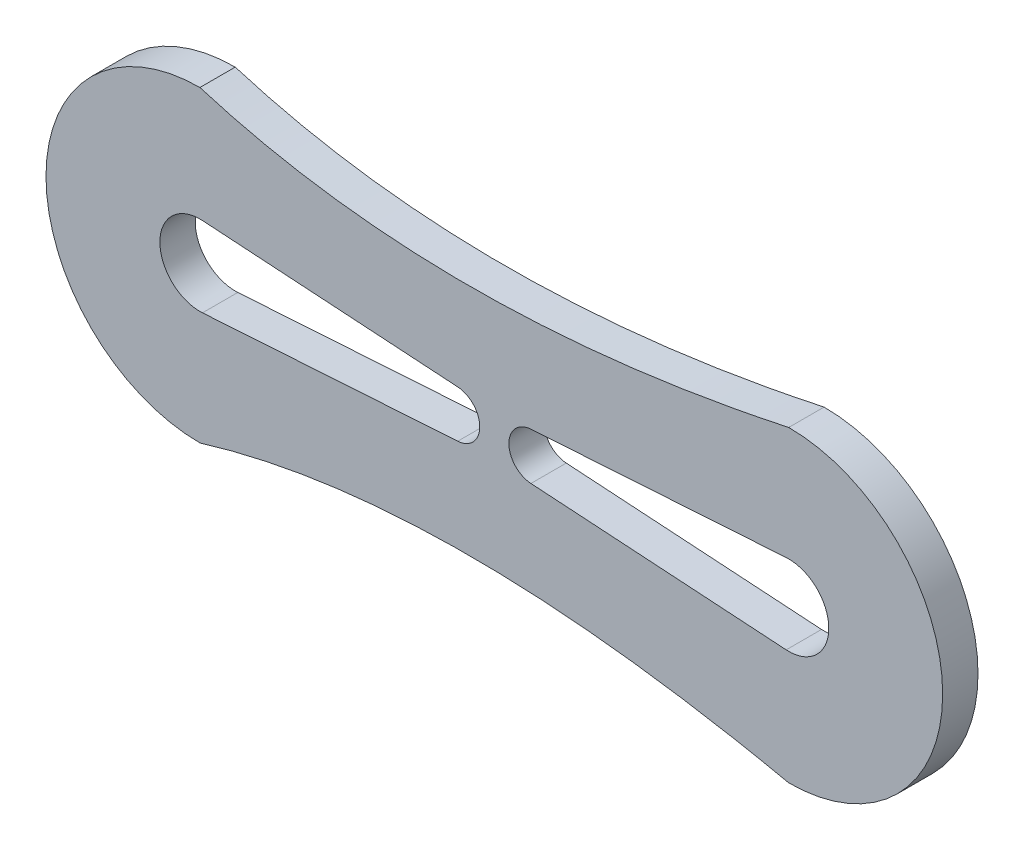
ISO-10303-21;
HEADER;
FILE_DESCRIPTION(('STEP AP214'),'2;1');
FILE_NAME('part.step','',(''),(''),'','','');
FILE_SCHEMA(('AUTOMOTIVE_DESIGN { 1 0 10303 214 1 1 1 1 }'));
ENDSEC;
DATA;
#1=APPLICATION_CONTEXT('core data for automotive mechanical design processes');
#2=APPLICATION_PROTOCOL_DEFINITION('international standard','automotive_design',2000,#1);
#3=PRODUCT_CONTEXT('',#1,'mechanical');
#4=PRODUCT('Part','Part','',(#3));
#5=PRODUCT_RELATED_PRODUCT_CATEGORY('part','',(#4));
#6=PRODUCT_DEFINITION_FORMATION('','',#4);
#7=PRODUCT_DEFINITION_CONTEXT('part definition',#1,'design');
#8=PRODUCT_DEFINITION('design','',#6,#7);
#9=PRODUCT_DEFINITION_SHAPE('','',#8);
#10=(LENGTH_UNIT() NAMED_UNIT(*) SI_UNIT(.MILLI.,.METRE.));
#11=(NAMED_UNIT(*) PLANE_ANGLE_UNIT() SI_UNIT($,.RADIAN.));
#12=(NAMED_UNIT(*) SI_UNIT($,.STERADIAN.) SOLID_ANGLE_UNIT());
#13=UNCERTAINTY_MEASURE_WITH_UNIT(LENGTH_MEASURE(1.E-05),#10,'distance_accuracy_value','');
#14=(GEOMETRIC_REPRESENTATION_CONTEXT(3) GLOBAL_UNCERTAINTY_ASSIGNED_CONTEXT((#13)) GLOBAL_UNIT_ASSIGNED_CONTEXT((#10,
#11,#12)) REPRESENTATION_CONTEXT('',''));
#15=CARTESIAN_POINT('',(0.,0.,0.));
#16=DIRECTION('',(0.,0.,1.));
#17=DIRECTION('',(1.,0.,0.));
#18=AXIS2_PLACEMENT_3D('',#15,#16,#17);
#19=CARTESIAN_POINT('',(-25.,0.,3.));
#20=DIRECTION('',(0.,0.,-1.));
#21=DIRECTION('',(-1.,0.,0.));
#22=AXIS2_PLACEMENT_3D('',#19,#20,#21);
#23=CYLINDRICAL_SURFACE('',#22,13.069);
#24=CARTESIAN_POINT('',(-25.,0.,0.));
#25=DIRECTION('',(0.,0.,1.));
#26=DIRECTION('',(1.,0.,0.));
#27=AXIS2_PLACEMENT_3D('',#24,#25,#26);
#28=CIRCLE('',#27,13.069);
#29=CARTESIAN_POINT('',(-25.,13.069,0.));
#30=VERTEX_POINT('',#29);
#31=CARTESIAN_POINT('',(-25.,-13.069,0.));
#32=VERTEX_POINT('',#31);
#33=EDGE_CURVE('E242',#30,#32,#28,.T.);
#34=ORIENTED_EDGE('',*,*,#33,.T.);
#35=DIRECTION('',(0.,0.,-1.));
#36=VECTOR('',#35,1.);
#37=CARTESIAN_POINT('',(-25.,-13.069,3.));
#38=LINE('',#37,#36);
#39=CARTESIAN_POINT('',(-25.,-13.069,3.));
#40=VERTEX_POINT('',#39);
#41=EDGE_CURVE('E11',#40,#32,#38,.T.);
#42=ORIENTED_EDGE('',*,*,#41,.F.);
#43=CARTESIAN_POINT('',(-25.,0.,3.));
#44=DIRECTION('',(0.,0.,1.));
#45=DIRECTION('',(1.,0.,0.));
#46=AXIS2_PLACEMENT_3D('',#43,#44,#45);
#47=CIRCLE('',#46,13.069);
#48=CARTESIAN_POINT('',(-25.,13.069,3.));
#49=VERTEX_POINT('',#48);
#50=EDGE_CURVE('E139',#49,#40,#47,.T.);
#51=ORIENTED_EDGE('',*,*,#50,.F.);
#52=DIRECTION('',(0.,0.,-1.));
#53=VECTOR('',#52,1.);
#54=CARTESIAN_POINT('',(-25.,13.069,3.));
#55=LINE('',#54,#53);
#56=EDGE_CURVE('E54',#49,#30,#55,.T.);
#57=ORIENTED_EDGE('',*,*,#56,.T.);
#58=EDGE_LOOP('',(#34,#42,#51,#57));
#59=FACE_BOUND('',#58,.T.);
#60=ADVANCED_FACE('F35',(#59),#23,.T.);
#61=CARTESIAN_POINT('',(-25.,-13.069,3.));
#62=CARTESIAN_POINT('',(-4.3274762398374,-6.75242360120828,3.));
#63=CARTESIAN_POINT('',(25.,-13.069,3.));
#64=B_SPLINE_CURVE_WITH_KNOTS('',2,(#61,#62,#63),.UNSPECIFIED.,.F.,.F.,(3,3),(0.,1.),.UNSPECIFIED.);
#65=DIRECTION('',(0.,0.,-1.));
#66=VECTOR('',#65,1.);
#67=SURFACE_OF_LINEAR_EXTRUSION('',#64,#66);
#68=CARTESIAN_POINT('',(-25.,-13.069,0.));
#69=CARTESIAN_POINT('',(-4.3274762398374,-6.75242360120828,0.));
#70=CARTESIAN_POINT('',(25.,-13.069,0.));
#71=B_SPLINE_CURVE_WITH_KNOTS('',2,(#68,#69,#70),.UNSPECIFIED.,.F.,.F.,(3,3),(0.,1.),.UNSPECIFIED.);
#72=CARTESIAN_POINT('',(25.,-13.069,0.));
#73=VERTEX_POINT('',#72);
#74=EDGE_CURVE('E145',#32,#73,#71,.T.);
#75=ORIENTED_EDGE('',*,*,#74,.T.);
#76=DIRECTION('',(0.,0.,-1.));
#77=VECTOR('',#76,1.);
#78=CARTESIAN_POINT('',(25.,-13.069,3.));
#79=LINE('',#78,#77);
#80=CARTESIAN_POINT('',(25.,-13.069,3.));
#81=VERTEX_POINT('',#80);
#82=EDGE_CURVE('E45',#81,#73,#79,.T.);
#83=ORIENTED_EDGE('',*,*,#82,.F.);
#84=EDGE_CURVE('E133',#40,#81,#64,.T.);
#85=ORIENTED_EDGE('',*,*,#84,.F.);
#86=ORIENTED_EDGE('',*,*,#41,.T.);
#87=EDGE_LOOP('',(#75,#83,#85,#86));
#88=FACE_BOUND('',#87,.T.);
#89=ADVANCED_FACE('F144',(#88),#67,.F.);
#90=CARTESIAN_POINT('',(25.,0.,3.));
#91=DIRECTION('',(0.,0.,-1.));
#92=DIRECTION('',(-1.,0.,0.));
#93=AXIS2_PLACEMENT_3D('',#90,#91,#92);
#94=CYLINDRICAL_SURFACE('',#93,13.069);
#95=CARTESIAN_POINT('',(25.,0.,0.));
#96=DIRECTION('',(0.,0.,1.));
#97=DIRECTION('',(1.,0.,0.));
#98=AXIS2_PLACEMENT_3D('',#95,#96,#97);
#99=CIRCLE('',#98,13.069);
#100=CARTESIAN_POINT('',(25.,13.069,0.));
#101=VERTEX_POINT('',#100);
#102=EDGE_CURVE('E247',#101,#73,#99,.F.);
#103=ORIENTED_EDGE('',*,*,#102,.F.);
#104=DIRECTION('',(0.,0.,-1.));
#105=VECTOR('',#104,1.);
#106=CARTESIAN_POINT('',(25.,13.069,3.));
#107=LINE('',#106,#105);
#108=CARTESIAN_POINT('',(25.,13.069,3.));
#109=VERTEX_POINT('',#108);
#110=EDGE_CURVE('E92',#109,#101,#107,.T.);
#111=ORIENTED_EDGE('',*,*,#110,.F.);
#112=CARTESIAN_POINT('',(25.,0.,3.));
#113=DIRECTION('',(0.,0.,1.));
#114=DIRECTION('',(1.,0.,0.));
#115=AXIS2_PLACEMENT_3D('',#112,#113,#114);
#116=CIRCLE('',#115,13.069);
#117=EDGE_CURVE('E138',#109,#81,#116,.F.);
#118=ORIENTED_EDGE('',*,*,#117,.T.);
#119=ORIENTED_EDGE('',*,*,#82,.T.);
#120=EDGE_LOOP('',(#103,#111,#118,#119));
#121=FACE_BOUND('',#120,.T.);
#122=ADVANCED_FACE('F149',(#121),#94,.T.);
#123=CARTESIAN_POINT('',(-3.236,0.,3.));
#124=DIRECTION('',(0.,0.,-1.));
#125=DIRECTION('',(-1.,0.,0.));
#126=AXIS2_PLACEMENT_3D('',#123,#124,#125);
#127=CYLINDRICAL_SURFACE('',#126,2.);
#128=CARTESIAN_POINT('',(-3.236,0.,0.));
#129=DIRECTION('',(0.,0.,1.));
#130=DIRECTION('',(1.,0.,0.));
#131=AXIS2_PLACEMENT_3D('',#128,#129,#130);
#132=CIRCLE('',#131,2.);
#133=CARTESIAN_POINT('',(-3.10734717882742,-1.99585782349453,0.));
#134=VERTEX_POINT('',#133);
#135=CARTESIAN_POINT('',(-3.10734717882742,1.99585782349453,0.));
#136=VERTEX_POINT('',#135);
#137=EDGE_CURVE('E228',#134,#136,#132,.T.);
#138=ORIENTED_EDGE('',*,*,#137,.F.);
#139=DIRECTION('',(0.,0.,-1.));
#140=VECTOR('',#139,1.);
#141=CARTESIAN_POINT('',(-3.10734717882742,-1.99585782349453,3.));
#142=LINE('',#141,#140);
#143=CARTESIAN_POINT('',(-3.10734717882742,-1.99585782349453,3.));
#144=VERTEX_POINT('',#143);
#145=EDGE_CURVE('E262',#144,#134,#142,.T.);
#146=ORIENTED_EDGE('',*,*,#145,.F.);
#147=CARTESIAN_POINT('',(-3.236,0.,3.));
#148=DIRECTION('',(0.,0.,1.));
#149=DIRECTION('',(1.,0.,0.));
#150=AXIS2_PLACEMENT_3D('',#147,#148,#149);
#151=CIRCLE('',#150,2.);
#152=CARTESIAN_POINT('',(-3.10734717882742,1.99585782349453,3.));
#153=VERTEX_POINT('',#152);
#154=EDGE_CURVE('E277',#144,#153,#151,.T.);
#155=ORIENTED_EDGE('',*,*,#154,.T.);
#156=DIRECTION('',(0.,0.,-1.));
#157=VECTOR('',#156,1.);
#158=CARTESIAN_POINT('',(-3.10734717882742,1.99585782349453,3.));
#159=LINE('',#158,#157);
#160=EDGE_CURVE('E264',#153,#136,#159,.T.);
#161=ORIENTED_EDGE('',*,*,#160,.T.);
#162=EDGE_LOOP('',(#138,#146,#155,#161));
#163=FACE_BOUND('',#162,.T.);
#164=ADVANCED_FACE('F177',(#163),#127,.F.);
#165=CARTESIAN_POINT('',(0.115262618520487,-1.78812867711612,3.));
#166=DIRECTION('',(-0.0643264105862892,0.997928911747267,0.));
#167=DIRECTION('',(-0.997928911747267,-0.0643264105862892,0.));
#168=AXIS2_PLACEMENT_3D('',#165,#166,#167);
#169=PLANE('',#168);
#170=DIRECTION('',(0.997928911747267,0.0643264105862892,0.));
#171=VECTOR('',#170,1.);
#172=CARTESIAN_POINT('',(0.115262618520487,-1.78812867711612,0.));
#173=LINE('',#172,#171);
#174=CARTESIAN_POINT('',(-24.7812902040066,-3.39295829994071,0.));
#175=VERTEX_POINT('',#174);
#176=EDGE_CURVE('E233',#175,#134,#173,.T.);
#177=ORIENTED_EDGE('',*,*,#176,.F.);
#178=DIRECTION('',(0.,0.,-1.));
#179=VECTOR('',#178,1.);
#180=CARTESIAN_POINT('',(-24.7812902040066,-3.39295829994071,3.));
#181=LINE('',#180,#179);
#182=CARTESIAN_POINT('',(-24.7812902040066,-3.39295829994071,3.));
#183=VERTEX_POINT('',#182);
#184=EDGE_CURVE('E268',#183,#175,#181,.T.);
#185=ORIENTED_EDGE('',*,*,#184,.F.);
#186=DIRECTION('',(0.997928911747267,0.0643264105862892,0.));
#187=VECTOR('',#186,1.);
#188=CARTESIAN_POINT('',(0.115262618520487,-1.78812867711612,3.));
#189=LINE('',#188,#187);
#190=EDGE_CURVE('E280',#183,#144,#189,.T.);
#191=ORIENTED_EDGE('',*,*,#190,.T.);
#192=ORIENTED_EDGE('',*,*,#145,.T.);
#193=EDGE_LOOP('',(#177,#185,#191,#192));
#194=FACE_BOUND('',#193,.T.);
#195=ADVANCED_FACE('F190',(#194),#169,.T.);
#196=CARTESIAN_POINT('',(-25.,0.,3.));
#197=DIRECTION('',(0.,0.,-1.));
#198=DIRECTION('',(-1.,0.,0.));
#199=AXIS2_PLACEMENT_3D('',#196,#197,#198);
#200=CYLINDRICAL_SURFACE('',#199,3.4);
#201=CARTESIAN_POINT('',(-25.,0.,0.));
#202=DIRECTION('',(0.,0.,1.));
#203=DIRECTION('',(1.,0.,0.));
#204=AXIS2_PLACEMENT_3D('',#201,#202,#203);
#205=CIRCLE('',#204,3.4);
#206=CARTESIAN_POINT('',(-24.7812902040066,3.39295829994071,0.));
#207=VERTEX_POINT('',#206);
#208=EDGE_CURVE('E236',#207,#175,#205,.T.);
#209=ORIENTED_EDGE('',*,*,#208,.F.);
#210=DIRECTION('',(0.,0.,-1.));
#211=VECTOR('',#210,1.);
#212=CARTESIAN_POINT('',(-24.7812902040066,3.39295829994071,3.));
#213=LINE('',#212,#211);
#214=CARTESIAN_POINT('',(-24.7812902040066,3.39295829994071,3.));
#215=VERTEX_POINT('',#214);
#216=EDGE_CURVE('E266',#215,#207,#213,.T.);
#217=ORIENTED_EDGE('',*,*,#216,.F.);
#218=CARTESIAN_POINT('',(-25.,0.,3.));
#219=DIRECTION('',(0.,0.,1.));
#220=DIRECTION('',(1.,0.,0.));
#221=AXIS2_PLACEMENT_3D('',#218,#219,#220);
#222=CIRCLE('',#221,3.4);
#223=EDGE_CURVE('E287',#215,#183,#222,.T.);
#224=ORIENTED_EDGE('',*,*,#223,.T.);
#225=ORIENTED_EDGE('',*,*,#184,.T.);
#226=EDGE_LOOP('',(#209,#217,#224,#225));
#227=FACE_BOUND('',#226,.T.);
#228=ADVANCED_FACE('F187',(#227),#200,.F.);
#229=CARTESIAN_POINT('',(25.,0.,3.));
#230=DIRECTION('',(0.,0.,-1.));
#231=DIRECTION('',(-1.,0.,0.));
#232=AXIS2_PLACEMENT_3D('',#229,#230,#231);
#233=CYLINDRICAL_SURFACE('',#232,3.4);
#234=CARTESIAN_POINT('',(25.,0.,0.));
#235=DIRECTION('',(0.,0.,1.));
#236=DIRECTION('',(1.,0.,0.));
#237=AXIS2_PLACEMENT_3D('',#234,#235,#236);
#238=CIRCLE('',#237,3.4);
#239=CARTESIAN_POINT('',(24.7812902040066,3.39295829994071,0.));
#240=VERTEX_POINT('',#239);
#241=CARTESIAN_POINT('',(24.7812902040066,-3.3929582999407,0.));
#242=VERTEX_POINT('',#241);
#243=EDGE_CURVE('E162',#240,#242,#238,.F.);
#244=ORIENTED_EDGE('',*,*,#243,.T.);
#245=DIRECTION('',(0.,0.,-1.));
#246=VECTOR('',#245,1.);
#247=CARTESIAN_POINT('',(24.7812902040066,-3.3929582999407,3.));
#248=LINE('',#247,#246);
#249=CARTESIAN_POINT('',(24.7812902040066,-3.3929582999407,3.));
#250=VERTEX_POINT('',#249);
#251=EDGE_CURVE('E39',#250,#242,#248,.T.);
#252=ORIENTED_EDGE('',*,*,#251,.F.);
#253=CARTESIAN_POINT('',(25.,0.,3.));
#254=DIRECTION('',(0.,0.,1.));
#255=DIRECTION('',(1.,0.,0.));
#256=AXIS2_PLACEMENT_3D('',#253,#254,#255);
#257=CIRCLE('',#256,3.4);
#258=CARTESIAN_POINT('',(24.7812902040066,3.39295829994071,3.));
#259=VERTEX_POINT('',#258);
#260=EDGE_CURVE('E257',#259,#250,#257,.F.);
#261=ORIENTED_EDGE('',*,*,#260,.F.);
#262=DIRECTION('',(0.,0.,-1.));
#263=VECTOR('',#262,1.);
#264=CARTESIAN_POINT('',(24.7812902040066,3.39295829994071,3.));
#265=LINE('',#264,#263);
#266=EDGE_CURVE('E152',#259,#240,#265,.T.);
#267=ORIENTED_EDGE('',*,*,#266,.T.);
#268=EDGE_LOOP('',(#244,#252,#261,#267));
#269=FACE_BOUND('',#268,.T.);
#270=ADVANCED_FACE('F37',(#269),#233,.F.);
#271=CARTESIAN_POINT('',(-0.115262618520486,-1.78812867711612,3.));
#272=DIRECTION('',(-0.064326410586289,-0.997928911747267,0.));
#273=DIRECTION('',(0.997928911747267,-0.064326410586289,0.));
#274=AXIS2_PLACEMENT_3D('',#271,#272,#273);
#275=PLANE('',#274);
#276=DIRECTION('',(-0.997928911747267,0.064326410586289,0.));
#277=VECTOR('',#276,1.);
#278=CARTESIAN_POINT('',(-0.115262618520486,-1.78812867711612,0.));
#279=LINE('',#278,#277);
#280=CARTESIAN_POINT('',(3.10734717882743,-1.99585782349453,0.));
#281=VERTEX_POINT('',#280);
#282=EDGE_CURVE('E209',#242,#281,#279,.T.);
#283=ORIENTED_EDGE('',*,*,#282,.T.);
#284=DIRECTION('',(0.,0.,-1.));
#285=VECTOR('',#284,1.);
#286=CARTESIAN_POINT('',(3.10734717882743,-1.99585782349453,3.));
#287=LINE('',#286,#285);
#288=CARTESIAN_POINT('',(3.10734717882743,-1.99585782349453,3.));
#289=VERTEX_POINT('',#288);
#290=EDGE_CURVE('E211',#289,#281,#287,.T.);
#291=ORIENTED_EDGE('',*,*,#290,.F.);
#292=DIRECTION('',(-0.997928911747267,0.064326410586289,0.));
#293=VECTOR('',#292,1.);
#294=CARTESIAN_POINT('',(-0.115262618520486,-1.78812867711612,3.));
#295=LINE('',#294,#293);
#296=EDGE_CURVE('E105',#250,#289,#295,.T.);
#297=ORIENTED_EDGE('',*,*,#296,.F.);
#298=ORIENTED_EDGE('',*,*,#251,.T.);
#299=EDGE_LOOP('',(#283,#291,#297,#298));
#300=FACE_BOUND('',#299,.T.);
#301=ADVANCED_FACE('F202',(#300),#275,.F.);
#302=CARTESIAN_POINT('',(3.236,0.,3.));
#303=DIRECTION('',(0.,0.,-1.));
#304=DIRECTION('',(-1.,0.,0.));
#305=AXIS2_PLACEMENT_3D('',#302,#303,#304);
#306=CYLINDRICAL_SURFACE('',#305,2.);
#307=CARTESIAN_POINT('',(3.236,0.,0.));
#308=DIRECTION('',(0.,0.,1.));
#309=DIRECTION('',(1.,0.,0.));
#310=AXIS2_PLACEMENT_3D('',#307,#308,#309);
#311=CIRCLE('',#310,2.);
#312=CARTESIAN_POINT('',(3.10734717882743,1.99585782349453,0.));
#313=VERTEX_POINT('',#312);
#314=EDGE_CURVE('E218',#281,#313,#311,.F.);
#315=ORIENTED_EDGE('',*,*,#314,.T.);
#316=DIRECTION('',(0.,0.,-1.));
#317=VECTOR('',#316,1.);
#318=CARTESIAN_POINT('',(3.10734717882743,1.99585782349453,3.));
#319=LINE('',#318,#317);
#320=CARTESIAN_POINT('',(3.10734717882743,1.99585782349453,3.));
#321=VERTEX_POINT('',#320);
#322=EDGE_CURVE('E223',#321,#313,#319,.T.);
#323=ORIENTED_EDGE('',*,*,#322,.F.);
#324=CARTESIAN_POINT('',(3.236,0.,3.));
#325=DIRECTION('',(0.,0.,1.));
#326=DIRECTION('',(1.,0.,0.));
#327=AXIS2_PLACEMENT_3D('',#324,#325,#326);
#328=CIRCLE('',#327,2.);
#329=EDGE_CURVE('E222',#289,#321,#328,.F.);
#330=ORIENTED_EDGE('',*,*,#329,.F.);
#331=ORIENTED_EDGE('',*,*,#290,.T.);
#332=EDGE_LOOP('',(#315,#323,#330,#331));
#333=FACE_BOUND('',#332,.T.);
#334=ADVANCED_FACE('F185',(#333),#306,.F.);
#335=CARTESIAN_POINT('',(0.115262618520487,1.78812867711612,3.));
#336=DIRECTION('',(0.0643264105862892,0.997928911747267,0.));
#337=DIRECTION('',(-0.997928911747267,0.0643264105862892,0.));
#338=AXIS2_PLACEMENT_3D('',#335,#336,#337);
#339=PLANE('',#338);
#340=DIRECTION('',(0.997928911747267,-0.0643264105862892,0.));
#341=VECTOR('',#340,1.);
#342=CARTESIAN_POINT('',(0.115262618520487,1.78812867711612,0.));
#343=LINE('',#342,#341);
#344=EDGE_CURVE('E239',#207,#136,#343,.T.);
#345=ORIENTED_EDGE('',*,*,#344,.T.);
#346=ORIENTED_EDGE('',*,*,#160,.F.);
#347=DIRECTION('',(0.997928911747267,-0.0643264105862892,0.));
#348=VECTOR('',#347,1.);
#349=CARTESIAN_POINT('',(0.115262618520487,1.78812867711612,3.));
#350=LINE('',#349,#348);
#351=EDGE_CURVE('E290',#215,#153,#350,.T.);
#352=ORIENTED_EDGE('',*,*,#351,.F.);
#353=ORIENTED_EDGE('',*,*,#216,.T.);
#354=EDGE_LOOP('',(#345,#346,#352,#353));
#355=FACE_BOUND('',#354,.T.);
#356=ADVANCED_FACE('F182',(#355),#339,.F.);
#357=CARTESIAN_POINT('',(-0.115262618520487,1.78812867711612,3.));
#358=DIRECTION('',(0.0643264105862895,-0.997928911747267,0.));
#359=DIRECTION('',(0.997928911747267,0.0643264105862895,0.));
#360=AXIS2_PLACEMENT_3D('',#357,#358,#359);
#361=PLANE('',#360);
#362=DIRECTION('',(-0.997928911747267,-0.0643264105862895,0.));
#363=VECTOR('',#362,1.);
#364=CARTESIAN_POINT('',(-0.115262618520487,1.78812867711612,0.));
#365=LINE('',#364,#363);
#366=EDGE_CURVE('E226',#240,#313,#365,.T.);
#367=ORIENTED_EDGE('',*,*,#366,.F.);
#368=ORIENTED_EDGE('',*,*,#266,.F.);
#369=DIRECTION('',(-0.997928911747267,-0.0643264105862895,0.));
#370=VECTOR('',#369,1.);
#371=CARTESIAN_POINT('',(-0.115262618520487,1.78812867711612,3.));
#372=LINE('',#371,#370);
#373=EDGE_CURVE('E274',#259,#321,#372,.T.);
#374=ORIENTED_EDGE('',*,*,#373,.T.);
#375=ORIENTED_EDGE('',*,*,#322,.T.);
#376=EDGE_LOOP('',(#367,#368,#374,#375));
#377=FACE_BOUND('',#376,.T.);
#378=ADVANCED_FACE('F172',(#377),#361,.T.);
#379=CARTESIAN_POINT('',(-25.,13.069,3.));
#380=CARTESIAN_POINT('',(-4.32747623983741,6.75242360120829,3.));
#381=CARTESIAN_POINT('',(25.,13.069,3.));
#382=B_SPLINE_CURVE_WITH_KNOTS('',2,(#379,#380,#381),.UNSPECIFIED.,.F.,.F.,(3,3),(0.,1.),.UNSPECIFIED.);
#383=DIRECTION('',(0.,0.,-1.));
#384=VECTOR('',#383,1.);
#385=SURFACE_OF_LINEAR_EXTRUSION('',#382,#384);
#386=CARTESIAN_POINT('',(-25.,13.069,0.));
#387=CARTESIAN_POINT('',(-4.32747623983741,6.75242360120829,0.));
#388=CARTESIAN_POINT('',(25.,13.069,0.));
#389=B_SPLINE_CURVE_WITH_KNOTS('',2,(#386,#387,#388),.UNSPECIFIED.,.F.,.F.,(3,3),(0.,1.),.UNSPECIFIED.);
#390=EDGE_CURVE('E252',#30,#101,#389,.T.);
#391=ORIENTED_EDGE('',*,*,#390,.F.);
#392=ORIENTED_EDGE('',*,*,#56,.F.);
#393=EDGE_CURVE('E150',#49,#109,#382,.T.);
#394=ORIENTED_EDGE('',*,*,#393,.T.);
#395=ORIENTED_EDGE('',*,*,#110,.T.);
#396=EDGE_LOOP('',(#391,#392,#394,#395));
#397=FACE_BOUND('',#396,.T.);
#398=ADVANCED_FACE('F168',(#397),#385,.T.);
#399=CARTESIAN_POINT('',(0.,0.,3.));
#400=DIRECTION('',(0.,0.,1.));
#401=DIRECTION('',(1.,0.,0.));
#402=AXIS2_PLACEMENT_3D('',#399,#400,#401);
#403=PLANE('',#402);
#404=ORIENTED_EDGE('',*,*,#260,.T.);
#405=ORIENTED_EDGE('',*,*,#296,.T.);
#406=ORIENTED_EDGE('',*,*,#329,.T.);
#407=ORIENTED_EDGE('',*,*,#373,.F.);
#408=EDGE_LOOP('',(#404,#405,#406,#407));
#409=FACE_BOUND('',#408,.T.);
#410=ORIENTED_EDGE('',*,*,#154,.F.);
#411=ORIENTED_EDGE('',*,*,#190,.F.);
#412=ORIENTED_EDGE('',*,*,#223,.F.);
#413=ORIENTED_EDGE('',*,*,#351,.T.);
#414=EDGE_LOOP('',(#410,#411,#412,#413));
#415=FACE_BOUND('',#414,.T.);
#416=ORIENTED_EDGE('',*,*,#50,.T.);
#417=ORIENTED_EDGE('',*,*,#84,.T.);
#418=ORIENTED_EDGE('',*,*,#117,.F.);
#419=ORIENTED_EDGE('',*,*,#393,.F.);
#420=EDGE_LOOP('',(#416,#417,#418,#419));
#421=FACE_BOUND('',#420,.T.);
#422=ADVANCED_FACE('F135',(#409,#415,#421),#403,.T.);
#423=CARTESIAN_POINT('',(0.,0.,0.));
#424=DIRECTION('',(0.,0.,1.));
#425=DIRECTION('',(1.,0.,0.));
#426=AXIS2_PLACEMENT_3D('',#423,#424,#425);
#427=PLANE('',#426);
#428=ORIENTED_EDGE('',*,*,#243,.F.);
#429=ORIENTED_EDGE('',*,*,#366,.T.);
#430=ORIENTED_EDGE('',*,*,#314,.F.);
#431=ORIENTED_EDGE('',*,*,#282,.F.);
#432=EDGE_LOOP('',(#428,#429,#430,#431));
#433=FACE_BOUND('',#432,.T.);
#434=ORIENTED_EDGE('',*,*,#137,.T.);
#435=ORIENTED_EDGE('',*,*,#344,.F.);
#436=ORIENTED_EDGE('',*,*,#208,.T.);
#437=ORIENTED_EDGE('',*,*,#176,.T.);
#438=EDGE_LOOP('',(#434,#435,#436,#437));
#439=FACE_BOUND('',#438,.T.);
#440=ORIENTED_EDGE('',*,*,#33,.F.);
#441=ORIENTED_EDGE('',*,*,#390,.T.);
#442=ORIENTED_EDGE('',*,*,#102,.T.);
#443=ORIENTED_EDGE('',*,*,#74,.F.);
#444=EDGE_LOOP('',(#440,#441,#442,#443));
#445=FACE_BOUND('',#444,.T.);
#446=ADVANCED_FACE('F173',(#433,#439,#445),#427,.F.);
#447=CLOSED_SHELL('',(#60,#89,#122,#164,#195,#228,#270,#301,#334,#356,#378,#398,#422,#446));
#448=MANIFOLD_SOLID_BREP('B2',#447);
#449=ADVANCED_BREP_SHAPE_REPRESENTATION('',(#18,#448),#14);
#450=SHAPE_DEFINITION_REPRESENTATION(#9,#449);
ENDSEC;
END-ISO-10303-21;
